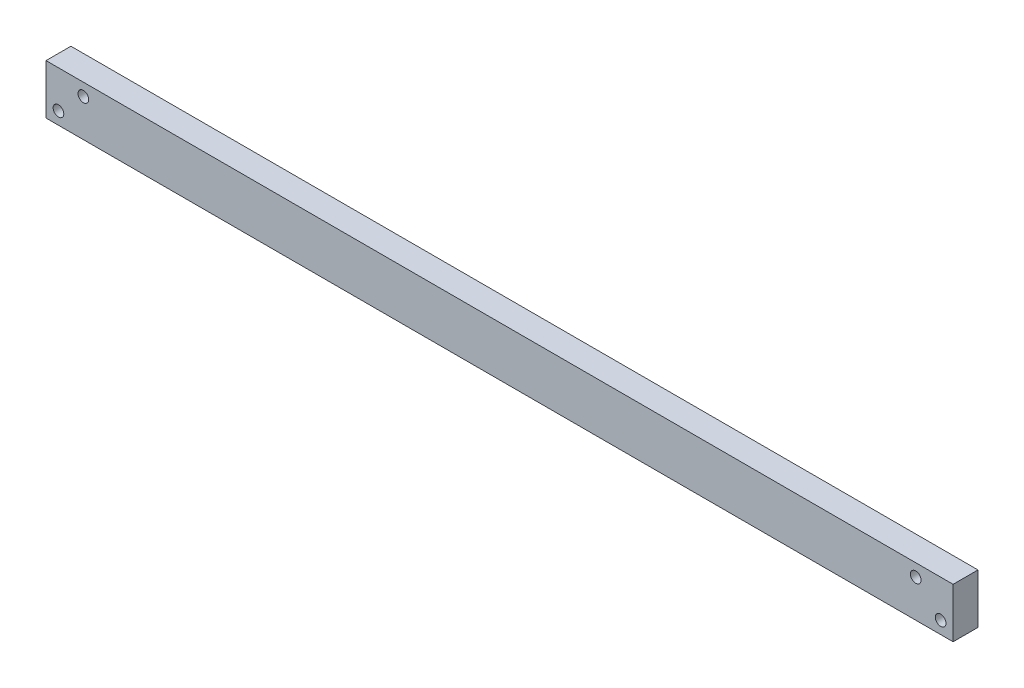
ISO-10303-21;
HEADER;
FILE_DESCRIPTION(('STEP AP214'),'2;1');
FILE_NAME('part.step','',(''),(''),'','','');
FILE_SCHEMA(('AUTOMOTIVE_DESIGN { 1 0 10303 214 1 1 1 1 }'));
ENDSEC;
DATA;
#1=APPLICATION_CONTEXT('core data for automotive mechanical design processes');
#2=APPLICATION_PROTOCOL_DEFINITION('international standard','automotive_design',2000,#1);
#3=PRODUCT_CONTEXT('',#1,'mechanical');
#4=PRODUCT('Part','Part','',(#3));
#5=PRODUCT_RELATED_PRODUCT_CATEGORY('part','',(#4));
#6=PRODUCT_DEFINITION_FORMATION('','',#4);
#7=PRODUCT_DEFINITION_CONTEXT('part definition',#1,'design');
#8=PRODUCT_DEFINITION('design','',#6,#7);
#9=PRODUCT_DEFINITION_SHAPE('','',#8);
#10=(LENGTH_UNIT() NAMED_UNIT(*) SI_UNIT(.MILLI.,.METRE.));
#11=(NAMED_UNIT(*) PLANE_ANGLE_UNIT() SI_UNIT($,.RADIAN.));
#12=(NAMED_UNIT(*) SI_UNIT($,.STERADIAN.) SOLID_ANGLE_UNIT());
#13=UNCERTAINTY_MEASURE_WITH_UNIT(LENGTH_MEASURE(1.E-05),#10,'distance_accuracy_value','');
#14=(GEOMETRIC_REPRESENTATION_CONTEXT(3) GLOBAL_UNCERTAINTY_ASSIGNED_CONTEXT((#13)) GLOBAL_UNIT_ASSIGNED_CONTEXT((#10,
#11,#12)) REPRESENTATION_CONTEXT('',''));
#15=CARTESIAN_POINT('',(0.,0.,0.));
#16=DIRECTION('',(0.,0.,1.));
#17=DIRECTION('',(1.,0.,0.));
#18=AXIS2_PLACEMENT_3D('',#15,#16,#17);
#19=CARTESIAN_POINT('',(255.,-14.,14.));
#20=DIRECTION('',(-1.,0.,0.));
#21=DIRECTION('',(0.,0.,1.));
#22=AXIS2_PLACEMENT_3D('',#19,#20,#21);
#23=PLANE('',#22);
#24=DIRECTION('',(0.,1.,0.));
#25=VECTOR('',#24,1.);
#26=CARTESIAN_POINT('',(255.,-14.,0.));
#27=LINE('',#26,#25);
#28=CARTESIAN_POINT('',(255.,-14.,0.));
#29=VERTEX_POINT('',#28);
#30=CARTESIAN_POINT('',(255.,14.,0.));
#31=VERTEX_POINT('',#30);
#32=EDGE_CURVE('E97',#29,#31,#27,.T.);
#33=ORIENTED_EDGE('',*,*,#32,.T.);
#34=DIRECTION('',(0.,0.,-1.));
#35=VECTOR('',#34,1.);
#36=CARTESIAN_POINT('',(255.,14.,14.));
#37=LINE('',#36,#35);
#38=CARTESIAN_POINT('',(255.,14.,14.));
#39=VERTEX_POINT('',#38);
#40=EDGE_CURVE('E11',#39,#31,#37,.T.);
#41=ORIENTED_EDGE('',*,*,#40,.F.);
#42=DIRECTION('',(0.,1.,0.));
#43=VECTOR('',#42,1.);
#44=CARTESIAN_POINT('',(255.,-14.,14.));
#45=LINE('',#44,#43);
#46=CARTESIAN_POINT('',(255.,-14.,14.));
#47=VERTEX_POINT('',#46);
#48=EDGE_CURVE('E85',#47,#39,#45,.T.);
#49=ORIENTED_EDGE('',*,*,#48,.F.);
#50=DIRECTION('',(0.,0.,-1.));
#51=VECTOR('',#50,1.);
#52=CARTESIAN_POINT('',(255.,-14.,14.));
#53=LINE('',#52,#51);
#54=EDGE_CURVE('E93',#47,#29,#53,.T.);
#55=ORIENTED_EDGE('',*,*,#54,.T.);
#56=EDGE_LOOP('',(#33,#41,#49,#55));
#57=FACE_BOUND('',#56,.T.);
#58=ADVANCED_FACE('F34',(#57),#23,.F.);
#59=CARTESIAN_POINT('',(-255.,14.,14.));
#60=DIRECTION('',(0.,-1.,0.));
#61=DIRECTION('',(0.,0.,-1.));
#62=AXIS2_PLACEMENT_3D('',#59,#60,#61);
#63=PLANE('',#62);
#64=DIRECTION('',(-1.,0.,0.));
#65=VECTOR('',#64,1.);
#66=CARTESIAN_POINT('',(-255.,14.,0.));
#67=LINE('',#66,#65);
#68=CARTESIAN_POINT('',(-255.,14.,0.));
#69=VERTEX_POINT('',#68);
#70=EDGE_CURVE('E89',#31,#69,#67,.T.);
#71=ORIENTED_EDGE('',*,*,#70,.T.);
#72=DIRECTION('',(0.,0.,-1.));
#73=VECTOR('',#72,1.);
#74=CARTESIAN_POINT('',(-255.,14.,14.));
#75=LINE('',#74,#73);
#76=CARTESIAN_POINT('',(-255.,14.,14.));
#77=VERTEX_POINT('',#76);
#78=EDGE_CURVE('E42',#77,#69,#75,.T.);
#79=ORIENTED_EDGE('',*,*,#78,.F.);
#80=DIRECTION('',(-1.,0.,0.));
#81=VECTOR('',#80,1.);
#82=CARTESIAN_POINT('',(-255.,14.,14.));
#83=LINE('',#82,#81);
#84=EDGE_CURVE('E80',#39,#77,#83,.T.);
#85=ORIENTED_EDGE('',*,*,#84,.F.);
#86=ORIENTED_EDGE('',*,*,#40,.T.);
#87=EDGE_LOOP('',(#71,#79,#85,#86));
#88=FACE_BOUND('',#87,.T.);
#89=ADVANCED_FACE('F88',(#88),#63,.F.);
#90=CARTESIAN_POINT('',(-255.,-14.,14.));
#91=DIRECTION('',(1.,0.,0.));
#92=DIRECTION('',(0.,0.,-1.));
#93=AXIS2_PLACEMENT_3D('',#90,#91,#92);
#94=PLANE('',#93);
#95=DIRECTION('',(0.,-1.,0.));
#96=VECTOR('',#95,1.);
#97=CARTESIAN_POINT('',(-255.,-14.,0.));
#98=LINE('',#97,#96);
#99=CARTESIAN_POINT('',(-255.,-14.,0.));
#100=VERTEX_POINT('',#99);
#101=EDGE_CURVE('E67',#69,#100,#98,.T.);
#102=ORIENTED_EDGE('',*,*,#101,.T.);
#103=DIRECTION('',(0.,0.,-1.));
#104=VECTOR('',#103,1.);
#105=CARTESIAN_POINT('',(-255.,-14.,14.));
#106=LINE('',#105,#104);
#107=CARTESIAN_POINT('',(-255.,-14.,14.));
#108=VERTEX_POINT('',#107);
#109=EDGE_CURVE('E90',#108,#100,#106,.T.);
#110=ORIENTED_EDGE('',*,*,#109,.F.);
#111=DIRECTION('',(0.,-1.,0.));
#112=VECTOR('',#111,1.);
#113=CARTESIAN_POINT('',(-255.,-14.,14.));
#114=LINE('',#113,#112);
#115=EDGE_CURVE('E83',#77,#108,#114,.T.);
#116=ORIENTED_EDGE('',*,*,#115,.F.);
#117=ORIENTED_EDGE('',*,*,#78,.T.);
#118=EDGE_LOOP('',(#102,#110,#116,#117));
#119=FACE_BOUND('',#118,.T.);
#120=ADVANCED_FACE('F91',(#119),#94,.F.);
#121=CARTESIAN_POINT('',(-255.,-14.,14.));
#122=DIRECTION('',(0.,1.,0.));
#123=DIRECTION('',(0.,0.,1.));
#124=AXIS2_PLACEMENT_3D('',#121,#122,#123);
#125=PLANE('',#124);
#126=DIRECTION('',(1.,0.,0.));
#127=VECTOR('',#126,1.);
#128=CARTESIAN_POINT('',(-255.,-14.,0.));
#129=LINE('',#128,#127);
#130=EDGE_CURVE('E73',#100,#29,#129,.T.);
#131=ORIENTED_EDGE('',*,*,#130,.T.);
#132=ORIENTED_EDGE('',*,*,#54,.F.);
#133=DIRECTION('',(1.,0.,0.));
#134=VECTOR('',#133,1.);
#135=CARTESIAN_POINT('',(-255.,-14.,14.));
#136=LINE('',#135,#134);
#137=EDGE_CURVE('E50',#108,#47,#136,.T.);
#138=ORIENTED_EDGE('',*,*,#137,.F.);
#139=ORIENTED_EDGE('',*,*,#109,.T.);
#140=EDGE_LOOP('',(#131,#132,#138,#139));
#141=FACE_BOUND('',#140,.T.);
#142=ADVANCED_FACE('F105',(#141),#125,.F.);
#143=CARTESIAN_POINT('',(0.,0.,14.));
#144=DIRECTION('',(0.,0.,-1.));
#145=DIRECTION('',(-1.,0.,0.));
#146=AXIS2_PLACEMENT_3D('',#143,#144,#145);
#147=PLANE('',#146);
#148=CARTESIAN_POINT('',(234.,7.00000000000006,14.));
#149=DIRECTION('',(0.,0.,1.));
#150=DIRECTION('',(-1.,0.,0.));
#151=AXIS2_PLACEMENT_3D('',#148,#149,#150);
#152=CIRCLE('',#151,2.99999999999999);
#153=CARTESIAN_POINT('',(237.,7.00000000000006,14.));
#154=VERTEX_POINT('',#153);
#155=EDGE_CURVE('E120',#154,#154,#152,.T.);
#156=ORIENTED_EDGE('',*,*,#155,.F.);
#157=EDGE_LOOP('',(#156));
#158=FACE_BOUND('',#157,.T.);
#159=CARTESIAN_POINT('',(248.,-6.99999999999994,14.));
#160=DIRECTION('',(0.,0.,1.));
#161=DIRECTION('',(-1.,0.,0.));
#162=AXIS2_PLACEMENT_3D('',#159,#160,#161);
#163=CIRCLE('',#162,2.99999999999999);
#164=CARTESIAN_POINT('',(251.,-6.99999999999994,14.));
#165=VERTEX_POINT('',#164);
#166=EDGE_CURVE('E126',#165,#165,#163,.T.);
#167=ORIENTED_EDGE('',*,*,#166,.F.);
#168=EDGE_LOOP('',(#167));
#169=FACE_BOUND('',#168,.T.);
#170=CARTESIAN_POINT('',(-248.,-7.,14.));
#171=DIRECTION('',(0.,0.,1.));
#172=DIRECTION('',(1.,0.,0.));
#173=AXIS2_PLACEMENT_3D('',#170,#171,#172);
#174=CIRCLE('',#173,2.99999999999999);
#175=CARTESIAN_POINT('',(-245.,-7.,14.));
#176=VERTEX_POINT('',#175);
#177=EDGE_CURVE('E114',#176,#176,#174,.T.);
#178=ORIENTED_EDGE('',*,*,#177,.F.);
#179=EDGE_LOOP('',(#178));
#180=FACE_BOUND('',#179,.T.);
#181=CARTESIAN_POINT('',(-234.,7.,14.));
#182=DIRECTION('',(0.,0.,1.));
#183=DIRECTION('',(1.,0.,0.));
#184=AXIS2_PLACEMENT_3D('',#181,#182,#183);
#185=CIRCLE('',#184,2.99999999999999);
#186=CARTESIAN_POINT('',(-231.,7.,14.));
#187=VERTEX_POINT('',#186);
#188=EDGE_CURVE('E100',#187,#187,#185,.T.);
#189=ORIENTED_EDGE('',*,*,#188,.F.);
#190=EDGE_LOOP('',(#189));
#191=FACE_BOUND('',#190,.T.);
#192=ORIENTED_EDGE('',*,*,#48,.T.);
#193=ORIENTED_EDGE('',*,*,#84,.T.);
#194=ORIENTED_EDGE('',*,*,#115,.T.);
#195=ORIENTED_EDGE('',*,*,#137,.T.);
#196=EDGE_LOOP('',(#192,#193,#194,#195));
#197=FACE_BOUND('',#196,.T.);
#198=ADVANCED_FACE('F81',(#158,#169,#180,#191,#197),#147,.F.);
#199=CARTESIAN_POINT('',(0.,0.,0.));
#200=DIRECTION('',(0.,0.,-1.));
#201=DIRECTION('',(-1.,0.,0.));
#202=AXIS2_PLACEMENT_3D('',#199,#200,#201);
#203=PLANE('',#202);
#204=CARTESIAN_POINT('',(234.,7.00000000000006,0.));
#205=DIRECTION('',(0.,0.,-1.));
#206=DIRECTION('',(-1.,0.,0.));
#207=AXIS2_PLACEMENT_3D('',#204,#205,#206);
#208=CIRCLE('',#207,2.99999999999999);
#209=CARTESIAN_POINT('',(237.,7.00000000000006,0.));
#210=VERTEX_POINT('',#209);
#211=EDGE_CURVE('E117',#210,#210,#208,.F.);
#212=ORIENTED_EDGE('',*,*,#211,.T.);
#213=EDGE_LOOP('',(#212));
#214=FACE_BOUND('',#213,.T.);
#215=CARTESIAN_POINT('',(248.,-6.99999999999994,0.));
#216=DIRECTION('',(0.,0.,-1.));
#217=DIRECTION('',(-1.,0.,0.));
#218=AXIS2_PLACEMENT_3D('',#215,#216,#217);
#219=CIRCLE('',#218,2.99999999999999);
#220=CARTESIAN_POINT('',(251.,-6.99999999999994,0.));
#221=VERTEX_POINT('',#220);
#222=EDGE_CURVE('E123',#221,#221,#219,.F.);
#223=ORIENTED_EDGE('',*,*,#222,.T.);
#224=EDGE_LOOP('',(#223));
#225=FACE_BOUND('',#224,.T.);
#226=CARTESIAN_POINT('',(-248.,-7.,0.));
#227=DIRECTION('',(0.,0.,-1.));
#228=DIRECTION('',(-1.,0.,0.));
#229=AXIS2_PLACEMENT_3D('',#226,#227,#228);
#230=CIRCLE('',#229,2.99999999999999);
#231=CARTESIAN_POINT('',(-245.,-7.,0.));
#232=VERTEX_POINT('',#231);
#233=EDGE_CURVE('E129',#232,#232,#230,.F.);
#234=ORIENTED_EDGE('',*,*,#233,.T.);
#235=EDGE_LOOP('',(#234));
#236=FACE_BOUND('',#235,.T.);
#237=CARTESIAN_POINT('',(-234.,7.,0.));
#238=DIRECTION('',(0.,0.,-1.));
#239=DIRECTION('',(-1.,0.,0.));
#240=AXIS2_PLACEMENT_3D('',#237,#238,#239);
#241=CIRCLE('',#240,2.99999999999999);
#242=CARTESIAN_POINT('',(-231.,7.,0.));
#243=VERTEX_POINT('',#242);
#244=EDGE_CURVE('E111',#243,#243,#241,.F.);
#245=ORIENTED_EDGE('',*,*,#244,.T.);
#246=EDGE_LOOP('',(#245));
#247=FACE_BOUND('',#246,.T.);
#248=ORIENTED_EDGE('',*,*,#32,.F.);
#249=ORIENTED_EDGE('',*,*,#130,.F.);
#250=ORIENTED_EDGE('',*,*,#101,.F.);
#251=ORIENTED_EDGE('',*,*,#70,.F.);
#252=EDGE_LOOP('',(#248,#249,#250,#251));
#253=FACE_BOUND('',#252,.T.);
#254=ADVANCED_FACE('F108',(#214,#225,#236,#247,#253),#203,.T.);
#255=CARTESIAN_POINT('',(-234.,7.,-0.000999999999999265));
#256=DIRECTION('',(0.,0.,1.));
#257=DIRECTION('',(1.,0.,0.));
#258=AXIS2_PLACEMENT_3D('',#255,#256,#257);
#259=CYLINDRICAL_SURFACE('',#258,2.99999999999999);
#260=CARTESIAN_POINT('',(-231.,7.,0.));
#261=CARTESIAN_POINT('',(-231.,7.,0.145833333333333));
#262=CARTESIAN_POINT('',(-231.,7.,0.291666666666667));
#263=CARTESIAN_POINT('',(-231.,7.,0.583333333333333));
#264=CARTESIAN_POINT('',(-231.,7.,0.729166666666667));
#265=CARTESIAN_POINT('',(-231.,7.,1.02083333333333));
#266=CARTESIAN_POINT('',(-231.,7.,1.16666666666667));
#267=CARTESIAN_POINT('',(-231.,7.,1.45833333333333));
#268=CARTESIAN_POINT('',(-231.,7.,1.60416666666667));
#269=CARTESIAN_POINT('',(-231.,7.,1.89583333333333));
#270=CARTESIAN_POINT('',(-231.,7.,2.04166666666667));
#271=CARTESIAN_POINT('',(-231.,7.,2.33333333333333));
#272=CARTESIAN_POINT('',(-231.,7.,2.47916666666667));
#273=CARTESIAN_POINT('',(-231.,7.,2.77083333333333));
#274=CARTESIAN_POINT('',(-231.,7.,2.91666666666667));
#275=CARTESIAN_POINT('',(-231.,7.,3.20833333333333));
#276=CARTESIAN_POINT('',(-231.,7.,3.35416666666667));
#277=CARTESIAN_POINT('',(-231.,7.,3.64583333333333));
#278=CARTESIAN_POINT('',(-231.,7.,3.79166666666667));
#279=CARTESIAN_POINT('',(-231.,7.,4.08333333333333));
#280=CARTESIAN_POINT('',(-231.,7.,4.22916666666667));
#281=CARTESIAN_POINT('',(-231.,7.,4.52083333333333));
#282=CARTESIAN_POINT('',(-231.,7.,4.66666666666667));
#283=CARTESIAN_POINT('',(-231.,7.,4.95833333333333));
#284=CARTESIAN_POINT('',(-231.,7.,5.10416666666667));
#285=CARTESIAN_POINT('',(-231.,7.,5.39583333333333));
#286=CARTESIAN_POINT('',(-231.,7.,5.54166666666667));
#287=CARTESIAN_POINT('',(-231.,7.,5.83333333333333));
#288=CARTESIAN_POINT('',(-231.,7.,5.97916666666667));
#289=CARTESIAN_POINT('',(-231.,7.,6.27083333333333));
#290=CARTESIAN_POINT('',(-231.,7.,6.41666666666667));
#291=CARTESIAN_POINT('',(-231.,7.,6.70833333333333));
#292=CARTESIAN_POINT('',(-231.,7.,6.85416666666667));
#293=CARTESIAN_POINT('',(-231.,7.,7.14583333333333));
#294=CARTESIAN_POINT('',(-231.,7.,7.29166666666667));
#295=CARTESIAN_POINT('',(-231.,7.,7.58333333333333));
#296=CARTESIAN_POINT('',(-231.,7.,7.72916666666667));
#297=CARTESIAN_POINT('',(-231.,7.,8.02083333333333));
#298=CARTESIAN_POINT('',(-231.,7.,8.16666666666667));
#299=CARTESIAN_POINT('',(-231.,7.,8.45833333333333));
#300=CARTESIAN_POINT('',(-231.,7.,8.60416666666667));
#301=CARTESIAN_POINT('',(-231.,7.,8.89583333333333));
#302=CARTESIAN_POINT('',(-231.,7.,9.04166666666666));
#303=CARTESIAN_POINT('',(-231.,7.,9.33333333333333));
#304=CARTESIAN_POINT('',(-231.,7.,9.47916666666667));
#305=CARTESIAN_POINT('',(-231.,7.,9.77083333333333));
#306=CARTESIAN_POINT('',(-231.,7.,9.91666666666667));
#307=CARTESIAN_POINT('',(-231.,7.,10.2083333333333));
#308=CARTESIAN_POINT('',(-231.,7.,10.3541666666667));
#309=CARTESIAN_POINT('',(-231.,7.,10.6458333333333));
#310=CARTESIAN_POINT('',(-231.,7.,10.7916666666667));
#311=CARTESIAN_POINT('',(-231.,7.,11.0833333333333));
#312=CARTESIAN_POINT('',(-231.,7.,11.2291666666667));
#313=CARTESIAN_POINT('',(-231.,7.,11.5208333333333));
#314=CARTESIAN_POINT('',(-231.,7.,11.6666666666667));
#315=CARTESIAN_POINT('',(-231.,7.,11.9583333333333));
#316=CARTESIAN_POINT('',(-231.,7.,12.1041666666667));
#317=CARTESIAN_POINT('',(-231.,7.,12.3958333333333));
#318=CARTESIAN_POINT('',(-231.,7.,12.5416666666667));
#319=CARTESIAN_POINT('',(-231.,7.,12.8333333333333));
#320=CARTESIAN_POINT('',(-231.,7.,12.9791666666667));
#321=CARTESIAN_POINT('',(-231.,7.,13.2708333333333));
#322=CARTESIAN_POINT('',(-231.,7.,13.4166666666667));
#323=CARTESIAN_POINT('',(-231.,7.,13.7083333333333));
#324=CARTESIAN_POINT('',(-231.,7.,13.8541666666667));
#325=CARTESIAN_POINT('',(-231.,7.,14.));
#326=B_SPLINE_CURVE_WITH_KNOTS('',3,(#260,#261,#262,#263,#264,#265,#266,#267,#268,#269,#270,
#271,#272,#273,#274,#275,#276,#277,#278,#279,#280,#281,#282,#283,#284,#285,#286,#287,#288,#289,
#290,#291,#292,#293,#294,#295,#296,#297,#298,#299,#300,#301,#302,#303,#304,#305,#306,#307,#308,
#309,#310,#311,#312,#313,#314,#315,#316,#317,#318,#319,#320,#321,#322,#323,#324,#325),
.UNSPECIFIED.,.F.,.F.,(4,2,2,2,2,2,2,2,2,2,2,2,2,2,2,2,2,2,2,2,2,2,2,2,2,2,2,2,2,2,2,2,4),(0.,
0.4375,0.875,1.3125,1.75,2.1875,2.625,3.0625,3.5,3.9375,4.375,4.8125,5.25,5.6875,6.125,6.5625,
7.,7.4375,7.875,8.3125,8.75,9.1875,9.625,10.0625,10.5,10.9375,11.375,11.8125,12.25,12.6875,
13.125,13.5625,14.),.UNSPECIFIED.);
#327=EDGE_CURVE('BSEAM143',#243,#187,#326,.T.);
#328=ORIENTED_EDGE('',*,*,#244,.F.);
#329=ORIENTED_EDGE('',*,*,#188,.T.);
#330=ORIENTED_EDGE('',*,*,#327,.T.);
#331=ORIENTED_EDGE('',*,*,#327,.F.);
#332=EDGE_LOOP('',(#328,#330,#329,#331));
#333=FACE_BOUND('',#332,.T.);
#334=ADVANCED_FACE('F143',(#333),#259,.F.);
#335=CARTESIAN_POINT('',(-248.,-7.,-0.000999999999999265));
#336=DIRECTION('',(0.,0.,1.));
#337=DIRECTION('',(1.,0.,0.));
#338=AXIS2_PLACEMENT_3D('',#335,#336,#337);
#339=CYLINDRICAL_SURFACE('',#338,2.99999999999999);
#340=CARTESIAN_POINT('',(-245.,-7.,0.));
#341=CARTESIAN_POINT('',(-245.,-7.,0.145833333333333));
#342=CARTESIAN_POINT('',(-245.,-7.,0.291666666666667));
#343=CARTESIAN_POINT('',(-245.,-7.,0.583333333333333));
#344=CARTESIAN_POINT('',(-245.,-7.,0.729166666666667));
#345=CARTESIAN_POINT('',(-245.,-7.,1.02083333333333));
#346=CARTESIAN_POINT('',(-245.,-7.,1.16666666666667));
#347=CARTESIAN_POINT('',(-245.,-7.,1.45833333333333));
#348=CARTESIAN_POINT('',(-245.,-7.,1.60416666666667));
#349=CARTESIAN_POINT('',(-245.,-7.,1.89583333333333));
#350=CARTESIAN_POINT('',(-245.,-7.,2.04166666666667));
#351=CARTESIAN_POINT('',(-245.,-7.,2.33333333333333));
#352=CARTESIAN_POINT('',(-245.,-7.,2.47916666666667));
#353=CARTESIAN_POINT('',(-245.,-7.,2.77083333333333));
#354=CARTESIAN_POINT('',(-245.,-7.,2.91666666666667));
#355=CARTESIAN_POINT('',(-245.,-7.,3.20833333333333));
#356=CARTESIAN_POINT('',(-245.,-7.,3.35416666666667));
#357=CARTESIAN_POINT('',(-245.,-7.,3.64583333333333));
#358=CARTESIAN_POINT('',(-245.,-7.,3.79166666666667));
#359=CARTESIAN_POINT('',(-245.,-7.,4.08333333333333));
#360=CARTESIAN_POINT('',(-245.,-7.,4.22916666666667));
#361=CARTESIAN_POINT('',(-245.,-7.,4.52083333333333));
#362=CARTESIAN_POINT('',(-245.,-7.,4.66666666666667));
#363=CARTESIAN_POINT('',(-245.,-7.,4.95833333333333));
#364=CARTESIAN_POINT('',(-245.,-7.,5.10416666666667));
#365=CARTESIAN_POINT('',(-245.,-7.,5.39583333333333));
#366=CARTESIAN_POINT('',(-245.,-7.,5.54166666666667));
#367=CARTESIAN_POINT('',(-245.,-7.,5.83333333333333));
#368=CARTESIAN_POINT('',(-245.,-7.,5.97916666666667));
#369=CARTESIAN_POINT('',(-245.,-7.,6.27083333333333));
#370=CARTESIAN_POINT('',(-245.,-7.,6.41666666666667));
#371=CARTESIAN_POINT('',(-245.,-7.,6.70833333333333));
#372=CARTESIAN_POINT('',(-245.,-7.,6.85416666666667));
#373=CARTESIAN_POINT('',(-245.,-7.,7.14583333333333));
#374=CARTESIAN_POINT('',(-245.,-7.,7.29166666666667));
#375=CARTESIAN_POINT('',(-245.,-7.,7.58333333333333));
#376=CARTESIAN_POINT('',(-245.,-7.,7.72916666666667));
#377=CARTESIAN_POINT('',(-245.,-7.,8.02083333333333));
#378=CARTESIAN_POINT('',(-245.,-7.,8.16666666666667));
#379=CARTESIAN_POINT('',(-245.,-7.,8.45833333333333));
#380=CARTESIAN_POINT('',(-245.,-7.,8.60416666666667));
#381=CARTESIAN_POINT('',(-245.,-7.,8.89583333333333));
#382=CARTESIAN_POINT('',(-245.,-7.,9.04166666666666));
#383=CARTESIAN_POINT('',(-245.,-7.,9.33333333333333));
#384=CARTESIAN_POINT('',(-245.,-7.,9.47916666666667));
#385=CARTESIAN_POINT('',(-245.,-7.,9.77083333333333));
#386=CARTESIAN_POINT('',(-245.,-7.,9.91666666666667));
#387=CARTESIAN_POINT('',(-245.,-7.,10.2083333333333));
#388=CARTESIAN_POINT('',(-245.,-7.,10.3541666666667));
#389=CARTESIAN_POINT('',(-245.,-7.,10.6458333333333));
#390=CARTESIAN_POINT('',(-245.,-7.,10.7916666666667));
#391=CARTESIAN_POINT('',(-245.,-7.,11.0833333333333));
#392=CARTESIAN_POINT('',(-245.,-7.,11.2291666666667));
#393=CARTESIAN_POINT('',(-245.,-7.,11.5208333333333));
#394=CARTESIAN_POINT('',(-245.,-7.,11.6666666666667));
#395=CARTESIAN_POINT('',(-245.,-7.,11.9583333333333));
#396=CARTESIAN_POINT('',(-245.,-7.,12.1041666666667));
#397=CARTESIAN_POINT('',(-245.,-7.,12.3958333333333));
#398=CARTESIAN_POINT('',(-245.,-7.,12.5416666666667));
#399=CARTESIAN_POINT('',(-245.,-7.,12.8333333333333));
#400=CARTESIAN_POINT('',(-245.,-7.,12.9791666666667));
#401=CARTESIAN_POINT('',(-245.,-7.,13.2708333333333));
#402=CARTESIAN_POINT('',(-245.,-7.,13.4166666666667));
#403=CARTESIAN_POINT('',(-245.,-7.,13.7083333333333));
#404=CARTESIAN_POINT('',(-245.,-7.,13.8541666666667));
#405=CARTESIAN_POINT('',(-245.,-7.,14.));
#406=B_SPLINE_CURVE_WITH_KNOTS('',3,(#340,#341,#342,#343,#344,#345,#346,#347,#348,#349,#350,
#351,#352,#353,#354,#355,#356,#357,#358,#359,#360,#361,#362,#363,#364,#365,#366,#367,#368,#369,
#370,#371,#372,#373,#374,#375,#376,#377,#378,#379,#380,#381,#382,#383,#384,#385,#386,#387,#388,
#389,#390,#391,#392,#393,#394,#395,#396,#397,#398,#399,#400,#401,#402,#403,#404,#405),
.UNSPECIFIED.,.F.,.F.,(4,2,2,2,2,2,2,2,2,2,2,2,2,2,2,2,2,2,2,2,2,2,2,2,2,2,2,2,2,2,2,2,4),(0.,
0.4375,0.875,1.3125,1.75,2.1875,2.625,3.0625,3.5,3.9375,4.375,4.8125,5.25,5.6875,6.125,6.5625,
7.,7.4375,7.875,8.3125,8.75,9.1875,9.625,10.0625,10.5,10.9375,11.375,11.8125,12.25,12.6875,
13.125,13.5625,14.),.UNSPECIFIED.);
#407=EDGE_CURVE('BSEAM135',#232,#176,#406,.T.);
#408=ORIENTED_EDGE('',*,*,#233,.F.);
#409=ORIENTED_EDGE('',*,*,#177,.T.);
#410=ORIENTED_EDGE('',*,*,#407,.T.);
#411=ORIENTED_EDGE('',*,*,#407,.F.);
#412=EDGE_LOOP('',(#408,#410,#409,#411));
#413=FACE_BOUND('',#412,.T.);
#414=ADVANCED_FACE('F135',(#413),#339,.F.);
#415=CARTESIAN_POINT('',(248.,-6.99999999999994,-0.000999999999999265));
#416=DIRECTION('',(0.,0.,1.));
#417=DIRECTION('',(1.,0.,0.));
#418=AXIS2_PLACEMENT_3D('',#415,#416,#417);
#419=CYLINDRICAL_SURFACE('',#418,2.99999999999999);
#420=CARTESIAN_POINT('',(251.,-6.99999999999994,0.));
#421=CARTESIAN_POINT('',(251.,-6.99999999999994,0.145833333333333));
#422=CARTESIAN_POINT('',(251.,-6.99999999999994,0.291666666666667));
#423=CARTESIAN_POINT('',(251.,-6.99999999999994,0.583333333333333));
#424=CARTESIAN_POINT('',(251.,-6.99999999999994,0.729166666666667));
#425=CARTESIAN_POINT('',(251.,-6.99999999999994,1.02083333333333));
#426=CARTESIAN_POINT('',(251.,-6.99999999999994,1.16666666666667));
#427=CARTESIAN_POINT('',(251.,-6.99999999999994,1.45833333333333));
#428=CARTESIAN_POINT('',(251.,-6.99999999999994,1.60416666666667));
#429=CARTESIAN_POINT('',(251.,-6.99999999999994,1.89583333333333));
#430=CARTESIAN_POINT('',(251.,-6.99999999999994,2.04166666666667));
#431=CARTESIAN_POINT('',(251.,-6.99999999999994,2.33333333333333));
#432=CARTESIAN_POINT('',(251.,-6.99999999999994,2.47916666666667));
#433=CARTESIAN_POINT('',(251.,-6.99999999999994,2.77083333333333));
#434=CARTESIAN_POINT('',(251.,-6.99999999999994,2.91666666666667));
#435=CARTESIAN_POINT('',(251.,-6.99999999999994,3.20833333333333));
#436=CARTESIAN_POINT('',(251.,-6.99999999999994,3.35416666666667));
#437=CARTESIAN_POINT('',(251.,-6.99999999999994,3.64583333333333));
#438=CARTESIAN_POINT('',(251.,-6.99999999999994,3.79166666666667));
#439=CARTESIAN_POINT('',(251.,-6.99999999999994,4.08333333333333));
#440=CARTESIAN_POINT('',(251.,-6.99999999999994,4.22916666666667));
#441=CARTESIAN_POINT('',(251.,-6.99999999999994,4.52083333333333));
#442=CARTESIAN_POINT('',(251.,-6.99999999999994,4.66666666666667));
#443=CARTESIAN_POINT('',(251.,-6.99999999999994,4.95833333333333));
#444=CARTESIAN_POINT('',(251.,-6.99999999999994,5.10416666666667));
#445=CARTESIAN_POINT('',(251.,-6.99999999999994,5.39583333333333));
#446=CARTESIAN_POINT('',(251.,-6.99999999999994,5.54166666666667));
#447=CARTESIAN_POINT('',(251.,-6.99999999999994,5.83333333333333));
#448=CARTESIAN_POINT('',(251.,-6.99999999999994,5.97916666666667));
#449=CARTESIAN_POINT('',(251.,-6.99999999999994,6.27083333333333));
#450=CARTESIAN_POINT('',(251.,-6.99999999999994,6.41666666666667));
#451=CARTESIAN_POINT('',(251.,-6.99999999999994,6.70833333333333));
#452=CARTESIAN_POINT('',(251.,-6.99999999999994,6.85416666666667));
#453=CARTESIAN_POINT('',(251.,-6.99999999999994,7.14583333333333));
#454=CARTESIAN_POINT('',(251.,-6.99999999999994,7.29166666666667));
#455=CARTESIAN_POINT('',(251.,-6.99999999999994,7.58333333333333));
#456=CARTESIAN_POINT('',(251.,-6.99999999999994,7.72916666666667));
#457=CARTESIAN_POINT('',(251.,-6.99999999999994,8.02083333333333));
#458=CARTESIAN_POINT('',(251.,-6.99999999999994,8.16666666666667));
#459=CARTESIAN_POINT('',(251.,-6.99999999999994,8.45833333333333));
#460=CARTESIAN_POINT('',(251.,-6.99999999999994,8.60416666666667));
#461=CARTESIAN_POINT('',(251.,-6.99999999999994,8.89583333333333));
#462=CARTESIAN_POINT('',(251.,-6.99999999999994,9.04166666666666));
#463=CARTESIAN_POINT('',(251.,-6.99999999999994,9.33333333333333));
#464=CARTESIAN_POINT('',(251.,-6.99999999999994,9.47916666666667));
#465=CARTESIAN_POINT('',(251.,-6.99999999999994,9.77083333333333));
#466=CARTESIAN_POINT('',(251.,-6.99999999999994,9.91666666666667));
#467=CARTESIAN_POINT('',(251.,-6.99999999999994,10.2083333333333));
#468=CARTESIAN_POINT('',(251.,-6.99999999999994,10.3541666666667));
#469=CARTESIAN_POINT('',(251.,-6.99999999999994,10.6458333333333));
#470=CARTESIAN_POINT('',(251.,-6.99999999999994,10.7916666666667));
#471=CARTESIAN_POINT('',(251.,-6.99999999999994,11.0833333333333));
#472=CARTESIAN_POINT('',(251.,-6.99999999999994,11.2291666666667));
#473=CARTESIAN_POINT('',(251.,-6.99999999999994,11.5208333333333));
#474=CARTESIAN_POINT('',(251.,-6.99999999999994,11.6666666666667));
#475=CARTESIAN_POINT('',(251.,-6.99999999999994,11.9583333333333));
#476=CARTESIAN_POINT('',(251.,-6.99999999999994,12.1041666666667));
#477=CARTESIAN_POINT('',(251.,-6.99999999999994,12.3958333333333));
#478=CARTESIAN_POINT('',(251.,-6.99999999999994,12.5416666666667));
#479=CARTESIAN_POINT('',(251.,-6.99999999999994,12.8333333333333));
#480=CARTESIAN_POINT('',(251.,-6.99999999999994,12.9791666666667));
#481=CARTESIAN_POINT('',(251.,-6.99999999999994,13.2708333333333));
#482=CARTESIAN_POINT('',(251.,-6.99999999999994,13.4166666666667));
#483=CARTESIAN_POINT('',(251.,-6.99999999999994,13.7083333333333));
#484=CARTESIAN_POINT('',(251.,-6.99999999999994,13.8541666666667));
#485=CARTESIAN_POINT('',(251.,-6.99999999999994,14.));
#486=B_SPLINE_CURVE_WITH_KNOTS('',3,(#420,#421,#422,#423,#424,#425,#426,#427,#428,#429,#430,
#431,#432,#433,#434,#435,#436,#437,#438,#439,#440,#441,#442,#443,#444,#445,#446,#447,#448,#449,
#450,#451,#452,#453,#454,#455,#456,#457,#458,#459,#460,#461,#462,#463,#464,#465,#466,#467,#468,
#469,#470,#471,#472,#473,#474,#475,#476,#477,#478,#479,#480,#481,#482,#483,#484,#485),
.UNSPECIFIED.,.F.,.F.,(4,2,2,2,2,2,2,2,2,2,2,2,2,2,2,2,2,2,2,2,2,2,2,2,2,2,2,2,2,2,2,2,4),(0.,
0.4375,0.875,1.3125,1.75,2.1875,2.625,3.0625,3.5,3.9375,4.375,4.8125,5.25,5.6875,6.125,6.5625,
7.,7.4375,7.875,8.3125,8.75,9.1875,9.625,10.0625,10.5,10.9375,11.375,11.8125,12.25,12.6875,
13.125,13.5625,14.),.UNSPECIFIED.);
#487=EDGE_CURVE('BSEAM151',#221,#165,#486,.T.);
#488=ORIENTED_EDGE('',*,*,#222,.F.);
#489=ORIENTED_EDGE('',*,*,#166,.T.);
#490=ORIENTED_EDGE('',*,*,#487,.T.);
#491=ORIENTED_EDGE('',*,*,#487,.F.);
#492=EDGE_LOOP('',(#488,#490,#489,#491));
#493=FACE_BOUND('',#492,.T.);
#494=ADVANCED_FACE('F151',(#493),#419,.F.);
#495=CARTESIAN_POINT('',(234.,7.00000000000006,-0.000999999999999265));
#496=DIRECTION('',(0.,0.,1.));
#497=DIRECTION('',(1.,0.,0.));
#498=AXIS2_PLACEMENT_3D('',#495,#496,#497);
#499=CYLINDRICAL_SURFACE('',#498,2.99999999999999);
#500=CARTESIAN_POINT('',(237.,7.00000000000006,0.));
#501=CARTESIAN_POINT('',(237.,7.00000000000006,0.145833333333333));
#502=CARTESIAN_POINT('',(237.,7.00000000000006,0.291666666666667));
#503=CARTESIAN_POINT('',(237.,7.00000000000006,0.583333333333333));
#504=CARTESIAN_POINT('',(237.,7.00000000000006,0.729166666666667));
#505=CARTESIAN_POINT('',(237.,7.00000000000006,1.02083333333333));
#506=CARTESIAN_POINT('',(237.,7.00000000000006,1.16666666666667));
#507=CARTESIAN_POINT('',(237.,7.00000000000006,1.45833333333333));
#508=CARTESIAN_POINT('',(237.,7.00000000000006,1.60416666666667));
#509=CARTESIAN_POINT('',(237.,7.00000000000006,1.89583333333333));
#510=CARTESIAN_POINT('',(237.,7.00000000000006,2.04166666666667));
#511=CARTESIAN_POINT('',(237.,7.00000000000006,2.33333333333333));
#512=CARTESIAN_POINT('',(237.,7.00000000000006,2.47916666666667));
#513=CARTESIAN_POINT('',(237.,7.00000000000006,2.77083333333333));
#514=CARTESIAN_POINT('',(237.,7.00000000000006,2.91666666666667));
#515=CARTESIAN_POINT('',(237.,7.00000000000006,3.20833333333333));
#516=CARTESIAN_POINT('',(237.,7.00000000000006,3.35416666666667));
#517=CARTESIAN_POINT('',(237.,7.00000000000006,3.64583333333333));
#518=CARTESIAN_POINT('',(237.,7.00000000000006,3.79166666666667));
#519=CARTESIAN_POINT('',(237.,7.00000000000006,4.08333333333333));
#520=CARTESIAN_POINT('',(237.,7.00000000000006,4.22916666666667));
#521=CARTESIAN_POINT('',(237.,7.00000000000006,4.52083333333333));
#522=CARTESIAN_POINT('',(237.,7.00000000000006,4.66666666666667));
#523=CARTESIAN_POINT('',(237.,7.00000000000006,4.95833333333333));
#524=CARTESIAN_POINT('',(237.,7.00000000000006,5.10416666666667));
#525=CARTESIAN_POINT('',(237.,7.00000000000006,5.39583333333333));
#526=CARTESIAN_POINT('',(237.,7.00000000000006,5.54166666666667));
#527=CARTESIAN_POINT('',(237.,7.00000000000006,5.83333333333333));
#528=CARTESIAN_POINT('',(237.,7.00000000000006,5.97916666666667));
#529=CARTESIAN_POINT('',(237.,7.00000000000006,6.27083333333333));
#530=CARTESIAN_POINT('',(237.,7.00000000000006,6.41666666666667));
#531=CARTESIAN_POINT('',(237.,7.00000000000006,6.70833333333333));
#532=CARTESIAN_POINT('',(237.,7.00000000000006,6.85416666666667));
#533=CARTESIAN_POINT('',(237.,7.00000000000006,7.14583333333333));
#534=CARTESIAN_POINT('',(237.,7.00000000000006,7.29166666666667));
#535=CARTESIAN_POINT('',(237.,7.00000000000006,7.58333333333333));
#536=CARTESIAN_POINT('',(237.,7.00000000000006,7.72916666666667));
#537=CARTESIAN_POINT('',(237.,7.00000000000006,8.02083333333333));
#538=CARTESIAN_POINT('',(237.,7.00000000000006,8.16666666666667));
#539=CARTESIAN_POINT('',(237.,7.00000000000006,8.45833333333333));
#540=CARTESIAN_POINT('',(237.,7.00000000000006,8.60416666666667));
#541=CARTESIAN_POINT('',(237.,7.00000000000006,8.89583333333333));
#542=CARTESIAN_POINT('',(237.,7.00000000000006,9.04166666666666));
#543=CARTESIAN_POINT('',(237.,7.00000000000006,9.33333333333333));
#544=CARTESIAN_POINT('',(237.,7.00000000000006,9.47916666666667));
#545=CARTESIAN_POINT('',(237.,7.00000000000006,9.77083333333333));
#546=CARTESIAN_POINT('',(237.,7.00000000000006,9.91666666666667));
#547=CARTESIAN_POINT('',(237.,7.00000000000006,10.2083333333333));
#548=CARTESIAN_POINT('',(237.,7.00000000000006,10.3541666666667));
#549=CARTESIAN_POINT('',(237.,7.00000000000006,10.6458333333333));
#550=CARTESIAN_POINT('',(237.,7.00000000000006,10.7916666666667));
#551=CARTESIAN_POINT('',(237.,7.00000000000006,11.0833333333333));
#552=CARTESIAN_POINT('',(237.,7.00000000000006,11.2291666666667));
#553=CARTESIAN_POINT('',(237.,7.00000000000006,11.5208333333333));
#554=CARTESIAN_POINT('',(237.,7.00000000000006,11.6666666666667));
#555=CARTESIAN_POINT('',(237.,7.00000000000006,11.9583333333333));
#556=CARTESIAN_POINT('',(237.,7.00000000000006,12.1041666666667));
#557=CARTESIAN_POINT('',(237.,7.00000000000006,12.3958333333333));
#558=CARTESIAN_POINT('',(237.,7.00000000000006,12.5416666666667));
#559=CARTESIAN_POINT('',(237.,7.00000000000006,12.8333333333333));
#560=CARTESIAN_POINT('',(237.,7.00000000000006,12.9791666666667));
#561=CARTESIAN_POINT('',(237.,7.00000000000006,13.2708333333333));
#562=CARTESIAN_POINT('',(237.,7.00000000000006,13.4166666666667));
#563=CARTESIAN_POINT('',(237.,7.00000000000006,13.7083333333333));
#564=CARTESIAN_POINT('',(237.,7.00000000000006,13.8541666666667));
#565=CARTESIAN_POINT('',(237.,7.00000000000006,14.));
#566=B_SPLINE_CURVE_WITH_KNOTS('',3,(#500,#501,#502,#503,#504,#505,#506,#507,#508,#509,#510,
#511,#512,#513,#514,#515,#516,#517,#518,#519,#520,#521,#522,#523,#524,#525,#526,#527,#528,#529,
#530,#531,#532,#533,#534,#535,#536,#537,#538,#539,#540,#541,#542,#543,#544,#545,#546,#547,#548,
#549,#550,#551,#552,#553,#554,#555,#556,#557,#558,#559,#560,#561,#562,#563,#564,#565),
.UNSPECIFIED.,.F.,.F.,(4,2,2,2,2,2,2,2,2,2,2,2,2,2,2,2,2,2,2,2,2,2,2,2,2,2,2,2,2,2,2,2,4),(0.,
0.4375,0.875,1.3125,1.75,2.1875,2.625,3.0625,3.5,3.9375,4.375,4.8125,5.25,5.6875,6.125,6.5625,
7.,7.4375,7.875,8.3125,8.75,9.1875,9.625,10.0625,10.5,10.9375,11.375,11.8125,12.25,12.6875,
13.125,13.5625,14.),.UNSPECIFIED.);
#567=EDGE_CURVE('BSEAM199',#210,#154,#566,.T.);
#568=ORIENTED_EDGE('',*,*,#211,.F.);
#569=ORIENTED_EDGE('',*,*,#155,.T.);
#570=ORIENTED_EDGE('',*,*,#567,.T.);
#571=ORIENTED_EDGE('',*,*,#567,.F.);
#572=EDGE_LOOP('',(#568,#570,#569,#571));
#573=FACE_BOUND('',#572,.T.);
#574=ADVANCED_FACE('F199',(#573),#499,.F.);
#575=CLOSED_SHELL('',(#58,#89,#120,#142,#198,#254,#334,#414,#494,#574));
#576=MANIFOLD_SOLID_BREP('B2',#575);
#577=ADVANCED_BREP_SHAPE_REPRESENTATION('',(#18,#576),#14);
#578=SHAPE_DEFINITION_REPRESENTATION(#9,#577);
ENDSEC;
END-ISO-10303-21;
